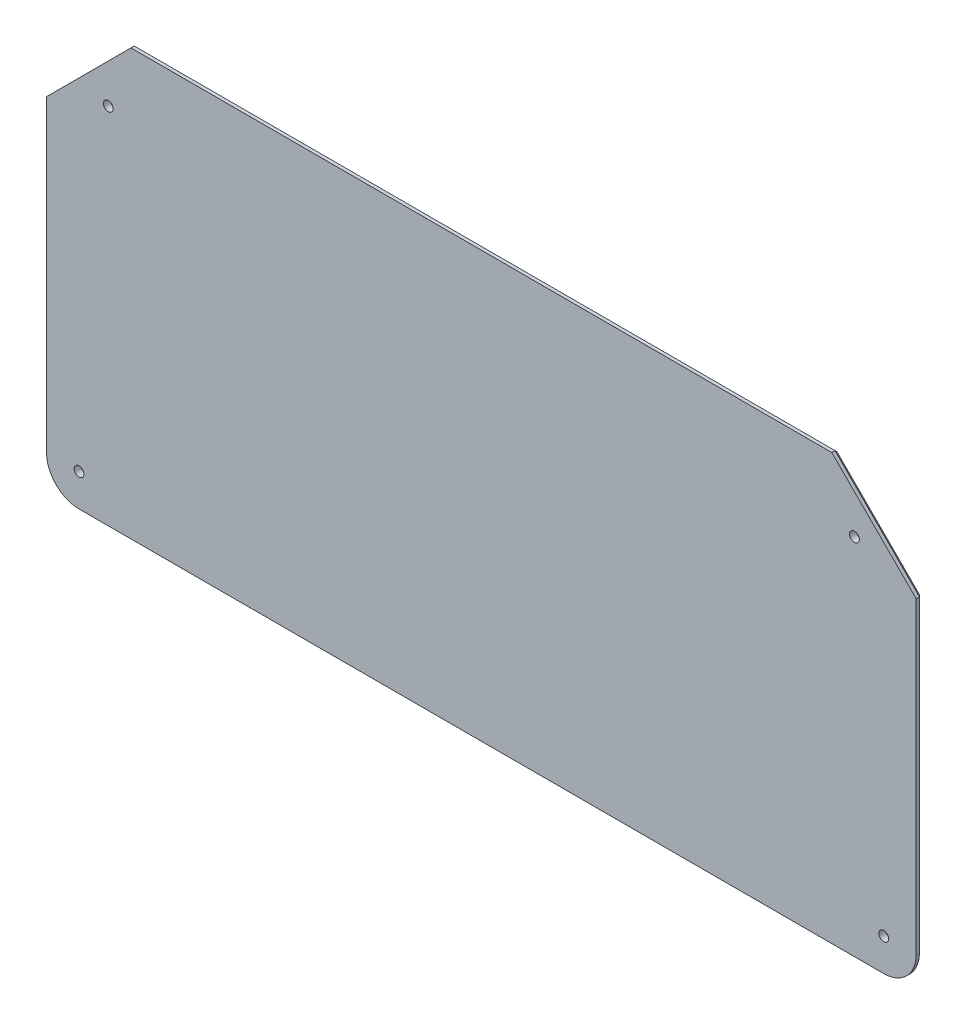
ISO-10303-21;
HEADER;
FILE_DESCRIPTION(('STEP AP214'),'2;1');
FILE_NAME('part.step','',(''),(''),'','','');
FILE_SCHEMA(('AUTOMOTIVE_DESIGN { 1 0 10303 214 1 1 1 1 }'));
ENDSEC;
DATA;
#1=APPLICATION_CONTEXT('core data for automotive mechanical design processes');
#2=APPLICATION_PROTOCOL_DEFINITION('international standard','automotive_design',2000,#1);
#3=PRODUCT_CONTEXT('',#1,'mechanical');
#4=PRODUCT('Part','Part','',(#3));
#5=PRODUCT_RELATED_PRODUCT_CATEGORY('part','',(#4));
#6=PRODUCT_DEFINITION_FORMATION('','',#4);
#7=PRODUCT_DEFINITION_CONTEXT('part definition',#1,'design');
#8=PRODUCT_DEFINITION('design','',#6,#7);
#9=PRODUCT_DEFINITION_SHAPE('','',#8);
#10=(LENGTH_UNIT() NAMED_UNIT(*) SI_UNIT(.MILLI.,.METRE.));
#11=(NAMED_UNIT(*) PLANE_ANGLE_UNIT() SI_UNIT($,.RADIAN.));
#12=(NAMED_UNIT(*) SI_UNIT($,.STERADIAN.) SOLID_ANGLE_UNIT());
#13=UNCERTAINTY_MEASURE_WITH_UNIT(LENGTH_MEASURE(1.E-05),#10,'distance_accuracy_value','');
#14=(GEOMETRIC_REPRESENTATION_CONTEXT(3) GLOBAL_UNCERTAINTY_ASSIGNED_CONTEXT((#13)) GLOBAL_UNIT_ASSIGNED_CONTEXT((#10,
#11,#12)) REPRESENTATION_CONTEXT('',''));
#15=CARTESIAN_POINT('',(0.,0.,0.));
#16=DIRECTION('',(0.,0.,1.));
#17=DIRECTION('',(1.,0.,0.));
#18=AXIS2_PLACEMENT_3D('',#15,#16,#17);
#19=CARTESIAN_POINT('',(192.203790483886,192.203790483885,-2.));
#20=DIRECTION('',(-0.707106781186548,-0.707106781186547,0.));
#21=DIRECTION('',(0.707106781186547,-0.707106781186548,0.));
#22=AXIS2_PLACEMENT_3D('',#19,#20,#21);
#23=PLANE('',#22);
#24=DIRECTION('',(0.,0.,1.));
#25=VECTOR('',#24,1.);
#26=CARTESIAN_POINT('',(274.168886442069,110.238694525702,-2.));
#27=LINE('',#26,#25);
#28=CARTESIAN_POINT('',(274.168886442069,110.238694525702,-1.));
#29=VERTEX_POINT('',#28);
#30=CARTESIAN_POINT('',(274.168886442069,110.238694525702,0.));
#31=VERTEX_POINT('',#30);
#32=EDGE_CURVE('E185',#29,#31,#27,.T.);
#33=ORIENTED_EDGE('',*,*,#32,.F.);
#34=DIRECTION('',(-0.707106781186547,0.707106781186548,0.));
#35=VECTOR('',#34,1.);
#36=CARTESIAN_POINT('',(192.203790483886,192.203790483885,-1.));
#37=LINE('',#36,#35);
#38=CARTESIAN_POINT('',(248.168886442069,136.238694525702,-0.999999999999999));
#39=VERTEX_POINT('',#38);
#40=EDGE_CURVE('E54',#29,#39,#37,.T.);
#41=ORIENTED_EDGE('',*,*,#40,.T.);
#42=DIRECTION('',(0.,0.,1.));
#43=VECTOR('',#42,1.);
#44=CARTESIAN_POINT('',(248.168886442069,136.238694525702,-2.));
#45=LINE('',#44,#43);
#46=CARTESIAN_POINT('',(248.168886442069,136.238694525702,0.));
#47=VERTEX_POINT('',#46);
#48=EDGE_CURVE('E133',#39,#47,#45,.T.);
#49=ORIENTED_EDGE('',*,*,#48,.T.);
#50=DIRECTION('',(0.707106781186547,-0.707106781186548,0.));
#51=VECTOR('',#50,1.);
#52=CARTESIAN_POINT('',(192.203790483886,192.203790483885,0.));
#53=LINE('',#52,#51);
#54=EDGE_CURVE('E136',#47,#31,#53,.T.);
#55=ORIENTED_EDGE('',*,*,#54,.T.);
#56=EDGE_LOOP('',(#33,#41,#49,#55));
#57=FACE_BOUND('',#56,.T.);
#58=ADVANCED_FACE('F43',(#57),#23,.F.);
#59=CARTESIAN_POINT('',(274.168886442069,0.,-2.));
#60=DIRECTION('',(-1.,0.,0.));
#61=DIRECTION('',(0.,0.,1.));
#62=AXIS2_PLACEMENT_3D('',#59,#60,#61);
#63=PLANE('',#62);
#64=DIRECTION('',(0.,0.,1.));
#65=VECTOR('',#64,1.);
#66=CARTESIAN_POINT('',(274.168886442069,15.286374555593,-2.));
#67=LINE('',#66,#65);
#68=CARTESIAN_POINT('',(274.168886442069,15.286374555593,-0.999999999999999));
#69=VERTEX_POINT('',#68);
#70=CARTESIAN_POINT('',(274.168886442069,15.286374555593,0.));
#71=VERTEX_POINT('',#70);
#72=EDGE_CURVE('E189',#69,#71,#67,.T.);
#73=ORIENTED_EDGE('',*,*,#72,.F.);
#74=DIRECTION('',(0.,1.,0.));
#75=VECTOR('',#74,1.);
#76=CARTESIAN_POINT('',(274.168886442069,0.,-0.999999999999999));
#77=LINE('',#76,#75);
#78=EDGE_CURVE('E69',#69,#29,#77,.T.);
#79=ORIENTED_EDGE('',*,*,#78,.T.);
#80=ORIENTED_EDGE('',*,*,#32,.T.);
#81=DIRECTION('',(0.,-1.,0.));
#82=VECTOR('',#81,1.);
#83=CARTESIAN_POINT('',(274.168886442069,0.,0.));
#84=LINE('',#83,#82);
#85=EDGE_CURVE('E141',#31,#71,#84,.T.);
#86=ORIENTED_EDGE('',*,*,#85,.T.);
#87=EDGE_LOOP('',(#73,#79,#80,#86));
#88=FACE_BOUND('',#87,.T.);
#89=ADVANCED_FACE('F331',(#88),#63,.F.);
#90=CARTESIAN_POINT('',(264.168886442069,15.2863745555929,-2.));
#91=DIRECTION('',(0.,0.,1.));
#92=DIRECTION('',(1.,0.,0.));
#93=AXIS2_PLACEMENT_3D('',#90,#91,#92);
#94=CYLINDRICAL_SURFACE('',#93,10.);
#95=DIRECTION('',(0.,0.,1.));
#96=VECTOR('',#95,1.);
#97=CARTESIAN_POINT('',(264.168886442069,5.28637455559292,-2.));
#98=LINE('',#97,#96);
#99=CARTESIAN_POINT('',(264.168886442069,5.28637455559292,-0.999999999999999));
#100=VERTEX_POINT('',#99);
#101=CARTESIAN_POINT('',(264.168886442069,5.28637455559292,0.));
#102=VERTEX_POINT('',#101);
#103=EDGE_CURVE('E192',#100,#102,#98,.T.);
#104=ORIENTED_EDGE('',*,*,#103,.F.);
#105=CARTESIAN_POINT('',(264.168886442069,15.2863745555929,-0.999999999999999));
#106=DIRECTION('',(0.,0.,1.));
#107=DIRECTION('',(1.,0.,0.));
#108=AXIS2_PLACEMENT_3D('',#105,#106,#107);
#109=CIRCLE('',#108,10.);
#110=EDGE_CURVE('E240',#100,#69,#109,.T.);
#111=ORIENTED_EDGE('',*,*,#110,.T.);
#112=ORIENTED_EDGE('',*,*,#72,.T.);
#113=CARTESIAN_POINT('',(264.168886442069,15.2863745555929,0.));
#114=DIRECTION('',(0.,0.,1.));
#115=DIRECTION('',(1.,0.,0.));
#116=AXIS2_PLACEMENT_3D('',#113,#114,#115);
#117=CIRCLE('',#116,10.);
#118=EDGE_CURVE('E180',#102,#71,#117,.T.);
#119=ORIENTED_EDGE('',*,*,#118,.F.);
#120=EDGE_LOOP('',(#104,#111,#112,#119));
#121=FACE_BOUND('',#120,.T.);
#122=ADVANCED_FACE('F336',(#121),#94,.T.);
#123=CARTESIAN_POINT('',(0.,5.28637455559292,-2.));
#124=DIRECTION('',(0.,-1.,0.));
#125=DIRECTION('',(0.,0.,-1.));
#126=AXIS2_PLACEMENT_3D('',#123,#124,#125);
#127=PLANE('',#126);
#128=DIRECTION('',(0.,0.,1.));
#129=VECTOR('',#128,1.);
#130=CARTESIAN_POINT('',(16.4118644100123,5.28637455559292,-2.));
#131=LINE('',#130,#129);
#132=CARTESIAN_POINT('',(16.4118644100123,5.28637455559292,-0.999999999999999));
#133=VERTEX_POINT('',#132);
#134=CARTESIAN_POINT('',(16.4118644100123,5.28637455559292,0.));
#135=VERTEX_POINT('',#134);
#136=EDGE_CURVE('E195',#133,#135,#131,.T.);
#137=ORIENTED_EDGE('',*,*,#136,.F.);
#138=DIRECTION('',(1.,0.,0.));
#139=VECTOR('',#138,1.);
#140=CARTESIAN_POINT('',(264.168886442069,5.28637455559292,-0.999999999999999));
#141=LINE('',#140,#139);
#142=EDGE_CURVE('E237',#133,#100,#141,.T.);
#143=ORIENTED_EDGE('',*,*,#142,.T.);
#144=ORIENTED_EDGE('',*,*,#103,.T.);
#145=DIRECTION('',(1.,0.,0.));
#146=VECTOR('',#145,1.);
#147=CARTESIAN_POINT('',(0.,5.28637455559292,0.));
#148=LINE('',#147,#146);
#149=EDGE_CURVE('E176',#135,#102,#148,.T.);
#150=ORIENTED_EDGE('',*,*,#149,.F.);
#151=EDGE_LOOP('',(#137,#143,#144,#150));
#152=FACE_BOUND('',#151,.T.);
#153=ADVANCED_FACE('F421',(#152),#127,.T.);
#154=CARTESIAN_POINT('',(16.4118644100122,15.2863745555929,-2.));
#155=DIRECTION('',(0.,0.,1.));
#156=DIRECTION('',(1.,0.,0.));
#157=AXIS2_PLACEMENT_3D('',#154,#155,#156);
#158=CYLINDRICAL_SURFACE('',#157,10.);
#159=DIRECTION('',(0.,0.,1.));
#160=VECTOR('',#159,1.);
#161=CARTESIAN_POINT('',(6.41186441001222,15.286374555593,-2.));
#162=LINE('',#161,#160);
#163=CARTESIAN_POINT('',(6.41186441001222,15.286374555593,-0.999999999999999));
#164=VERTEX_POINT('',#163);
#165=CARTESIAN_POINT('',(6.41186441001222,15.286374555593,0.));
#166=VERTEX_POINT('',#165);
#167=EDGE_CURVE('E198',#164,#166,#162,.T.);
#168=ORIENTED_EDGE('',*,*,#167,.F.);
#169=CARTESIAN_POINT('',(16.4118644100122,15.2863745555929,-0.999999999999999));
#170=DIRECTION('',(0.,0.,1.));
#171=DIRECTION('',(1.,0.,0.));
#172=AXIS2_PLACEMENT_3D('',#169,#170,#171);
#173=CIRCLE('',#172,10.);
#174=EDGE_CURVE('E234',#164,#133,#173,.T.);
#175=ORIENTED_EDGE('',*,*,#174,.T.);
#176=ORIENTED_EDGE('',*,*,#136,.T.);
#177=CARTESIAN_POINT('',(16.4118644100122,15.2863745555929,0.));
#178=DIRECTION('',(0.,0.,1.));
#179=DIRECTION('',(1.,0.,0.));
#180=AXIS2_PLACEMENT_3D('',#177,#178,#179);
#181=CIRCLE('',#180,10.);
#182=EDGE_CURVE('E172',#166,#135,#181,.T.);
#183=ORIENTED_EDGE('',*,*,#182,.F.);
#184=EDGE_LOOP('',(#168,#175,#176,#183));
#185=FACE_BOUND('',#184,.T.);
#186=ADVANCED_FACE('F416',(#185),#158,.T.);
#187=CARTESIAN_POINT('',(6.41186441001222,0.,-2.));
#188=DIRECTION('',(-1.,0.,0.));
#189=DIRECTION('',(0.,-1.,0.));
#190=AXIS2_PLACEMENT_3D('',#187,#188,#189);
#191=PLANE('',#190);
#192=DIRECTION('',(0.,0.,1.));
#193=VECTOR('',#192,1.);
#194=CARTESIAN_POINT('',(6.4118644100122,110.238694525702,-2.));
#195=LINE('',#194,#193);
#196=CARTESIAN_POINT('',(6.4118644100122,110.238694525702,-0.999999999999999));
#197=VERTEX_POINT('',#196);
#198=CARTESIAN_POINT('',(6.4118644100122,110.238694525702,0.));
#199=VERTEX_POINT('',#198);
#200=EDGE_CURVE('E201',#197,#199,#195,.T.);
#201=ORIENTED_EDGE('',*,*,#200,.F.);
#202=DIRECTION('',(0.,-1.,0.));
#203=VECTOR('',#202,1.);
#204=CARTESIAN_POINT('',(6.41186441001222,15.286374555593,-0.999999999999999));
#205=LINE('',#204,#203);
#206=EDGE_CURVE('E188',#197,#164,#205,.T.);
#207=ORIENTED_EDGE('',*,*,#206,.T.);
#208=ORIENTED_EDGE('',*,*,#167,.T.);
#209=DIRECTION('',(0.,-1.,0.));
#210=VECTOR('',#209,1.);
#211=CARTESIAN_POINT('',(6.41186441001222,0.,0.));
#212=LINE('',#211,#210);
#213=EDGE_CURVE('E168',#199,#166,#212,.T.);
#214=ORIENTED_EDGE('',*,*,#213,.F.);
#215=EDGE_LOOP('',(#201,#207,#208,#214));
#216=FACE_BOUND('',#215,.T.);
#217=ADVANCED_FACE('F410',(#216),#191,.T.);
#218=CARTESIAN_POINT('',(-51.9134150578452,51.9134150578457,-2.));
#219=DIRECTION('',(0.707106781186544,-0.707106781186551,0.));
#220=DIRECTION('',(0.707106781186551,0.707106781186544,0.));
#221=AXIS2_PLACEMENT_3D('',#218,#219,#220);
#222=PLANE('',#221);
#223=DIRECTION('',(0.,0.,1.));
#224=VECTOR('',#223,1.);
#225=CARTESIAN_POINT('',(32.4118644100122,136.238694525702,-2.));
#226=LINE('',#225,#224);
#227=CARTESIAN_POINT('',(32.4118644100122,136.238694525702,-0.999999999999999));
#228=VERTEX_POINT('',#227);
#229=CARTESIAN_POINT('',(32.4118644100122,136.238694525702,0.));
#230=VERTEX_POINT('',#229);
#231=EDGE_CURVE('E140',#228,#230,#226,.T.);
#232=ORIENTED_EDGE('',*,*,#231,.F.);
#233=DIRECTION('',(-0.707106781186551,-0.707106781186544,0.));
#234=VECTOR('',#233,1.);
#235=CARTESIAN_POINT('',(-51.9134150578452,51.9134150578457,-0.999999999999997));
#236=LINE('',#235,#234);
#237=EDGE_CURVE('E243',#228,#197,#236,.T.);
#238=ORIENTED_EDGE('',*,*,#237,.T.);
#239=ORIENTED_EDGE('',*,*,#200,.T.);
#240=DIRECTION('',(0.707106781186551,0.707106781186544,0.));
#241=VECTOR('',#240,1.);
#242=CARTESIAN_POINT('',(-51.9134150578452,51.9134150578457,0.));
#243=LINE('',#242,#241);
#244=EDGE_CURVE('E151',#199,#230,#243,.T.);
#245=ORIENTED_EDGE('',*,*,#244,.T.);
#246=EDGE_LOOP('',(#232,#238,#239,#245));
#247=FACE_BOUND('',#246,.T.);
#248=ADVANCED_FACE('F406',(#247),#222,.F.);
#249=CARTESIAN_POINT('',(0.,136.238694525702,-2.));
#250=DIRECTION('',(0.,-1.,0.));
#251=DIRECTION('',(0.,0.,-1.));
#252=AXIS2_PLACEMENT_3D('',#249,#250,#251);
#253=PLANE('',#252);
#254=ORIENTED_EDGE('',*,*,#48,.F.);
#255=DIRECTION('',(-1.,0.,0.));
#256=VECTOR('',#255,1.);
#257=CARTESIAN_POINT('',(0.,136.238694525702,-0.999999999999999));
#258=LINE('',#257,#256);
#259=EDGE_CURVE('E11',#39,#228,#258,.T.);
#260=ORIENTED_EDGE('',*,*,#259,.T.);
#261=ORIENTED_EDGE('',*,*,#231,.T.);
#262=DIRECTION('',(1.,0.,0.));
#263=VECTOR('',#262,1.);
#264=CARTESIAN_POINT('',(0.,136.238694525702,0.));
#265=LINE('',#264,#263);
#266=EDGE_CURVE('E144',#230,#47,#265,.T.);
#267=ORIENTED_EDGE('',*,*,#266,.T.);
#268=EDGE_LOOP('',(#254,#260,#261,#267));
#269=FACE_BOUND('',#268,.T.);
#270=ADVANCED_FACE('F145',(#269),#253,.F.);
#271=CARTESIAN_POINT('',(0.,0.,-2.));
#272=DIRECTION('',(0.,0.,1.));
#273=DIRECTION('',(1.,0.,0.));
#274=AXIS2_PLACEMENT_3D('',#271,#272,#273);
#275=PLANE('',#274);
#276=CARTESIAN_POINT('',(16.4118644100122,15.2863745555929,-2.));
#277=DIRECTION('',(0.,0.,1.));
#278=DIRECTION('',(1.,0.,0.));
#279=AXIS2_PLACEMENT_3D('',#276,#277,#278);
#280=CIRCLE('',#279,9.);
#281=CARTESIAN_POINT('',(16.4118644100123,6.28637455559292,-2.));
#282=VERTEX_POINT('',#281);
#283=CARTESIAN_POINT('',(7.41186441001222,15.286374555593,-2.));
#284=VERTEX_POINT('',#283);
#285=EDGE_CURVE('E227',#282,#284,#280,.F.);
#286=ORIENTED_EDGE('',*,*,#285,.T.);
#287=DIRECTION('',(0.,1.,0.));
#288=VECTOR('',#287,1.);
#289=CARTESIAN_POINT('',(7.4118644100122,110.238694525702,-2.));
#290=LINE('',#289,#288);
#291=CARTESIAN_POINT('',(7.4118644100122,109.824480963329,-2.));
#292=VERTEX_POINT('',#291);
#293=EDGE_CURVE('E230',#284,#292,#290,.T.);
#294=ORIENTED_EDGE('',*,*,#293,.T.);
#295=DIRECTION('',(0.707106781186551,0.707106781186544,0.));
#296=VECTOR('',#295,1.);
#297=CARTESIAN_POINT('',(-51.2063082766586,51.2063082766592,-2.));
#298=LINE('',#297,#296);
#299=CARTESIAN_POINT('',(32.8260779723853,135.238694525702,-2.));
#300=VERTEX_POINT('',#299);
#301=EDGE_CURVE('E218',#292,#300,#298,.T.);
#302=ORIENTED_EDGE('',*,*,#301,.T.);
#303=DIRECTION('',(1.,0.,0.));
#304=VECTOR('',#303,1.);
#305=CARTESIAN_POINT('',(0.,135.238694525702,-2.));
#306=LINE('',#305,#304);
#307=CARTESIAN_POINT('',(247.754672879696,135.238694525702,-2.));
#308=VERTEX_POINT('',#307);
#309=EDGE_CURVE('E209',#300,#308,#306,.T.);
#310=ORIENTED_EDGE('',*,*,#309,.T.);
#311=DIRECTION('',(0.707106781186547,-0.707106781186548,0.));
#312=VECTOR('',#311,1.);
#313=CARTESIAN_POINT('',(191.496683702699,191.496683702699,-2.));
#314=LINE('',#313,#312);
#315=CARTESIAN_POINT('',(273.168886442069,109.824480963329,-2.));
#316=VERTEX_POINT('',#315);
#317=EDGE_CURVE('E212',#308,#316,#314,.T.);
#318=ORIENTED_EDGE('',*,*,#317,.T.);
#319=DIRECTION('',(0.,-1.,0.));
#320=VECTOR('',#319,1.);
#321=CARTESIAN_POINT('',(273.168886442069,0.,-2.));
#322=LINE('',#321,#320);
#323=CARTESIAN_POINT('',(273.168886442069,15.286374555593,-2.));
#324=VERTEX_POINT('',#323);
#325=EDGE_CURVE('E215',#316,#324,#322,.T.);
#326=ORIENTED_EDGE('',*,*,#325,.T.);
#327=CARTESIAN_POINT('',(264.168886442069,15.2863745555929,-2.));
#328=DIRECTION('',(0.,0.,1.));
#329=DIRECTION('',(1.,0.,0.));
#330=AXIS2_PLACEMENT_3D('',#327,#328,#329);
#331=CIRCLE('',#330,9.00000000000001);
#332=CARTESIAN_POINT('',(264.168886442069,6.28637455559291,-2.));
#333=VERTEX_POINT('',#332);
#334=EDGE_CURVE('E221',#324,#333,#331,.F.);
#335=ORIENTED_EDGE('',*,*,#334,.T.);
#336=DIRECTION('',(-1.,0.,0.));
#337=VECTOR('',#336,1.);
#338=CARTESIAN_POINT('',(16.4118644100123,6.28637455559292,-2.));
#339=LINE('',#338,#337);
#340=EDGE_CURVE('E224',#333,#282,#339,.T.);
#341=ORIENTED_EDGE('',*,*,#340,.T.);
#342=EDGE_LOOP('',(#286,#294,#302,#310,#318,#326,#335,#341));
#343=FACE_BOUND('',#342,.T.);
#344=CARTESIAN_POINT('',(16.4118644100122,15.2863745555929,-2.));
#345=DIRECTION('',(0.,0.,1.));
#346=DIRECTION('',(1.,0.,0.));
#347=AXIS2_PLACEMENT_3D('',#344,#345,#346);
#348=CIRCLE('',#347,1.5);
#349=CARTESIAN_POINT('',(17.9118644100122,15.2863745555929,-2.));
#350=VERTEX_POINT('',#349);
#351=EDGE_CURVE('E286',#350,#350,#348,.T.);
#352=ORIENTED_EDGE('',*,*,#351,.T.);
#353=EDGE_LOOP('',(#352));
#354=FACE_BOUND('',#353,.T.);
#355=CARTESIAN_POINT('',(25.4222720500978,117.228286885617,-2.));
#356=DIRECTION('',(0.,0.,1.));
#357=DIRECTION('',(1.,0.,0.));
#358=AXIS2_PLACEMENT_3D('',#355,#356,#357);
#359=CIRCLE('',#358,1.5);
#360=CARTESIAN_POINT('',(26.9222720500978,117.228286885617,-2.));
#361=VERTEX_POINT('',#360);
#362=EDGE_CURVE('E298',#361,#361,#359,.T.);
#363=ORIENTED_EDGE('',*,*,#362,.T.);
#364=EDGE_LOOP('',(#363));
#365=FACE_BOUND('',#364,.T.);
#366=CARTESIAN_POINT('',(255.158478801983,117.228286885617,-2.));
#367=DIRECTION('',(0.,0.,1.));
#368=DIRECTION('',(1.,0.,0.));
#369=AXIS2_PLACEMENT_3D('',#366,#367,#368);
#370=CIRCLE('',#369,1.5);
#371=CARTESIAN_POINT('',(256.658478801983,117.228286885617,-2.));
#372=VERTEX_POINT('',#371);
#373=EDGE_CURVE('E306',#372,#372,#370,.T.);
#374=ORIENTED_EDGE('',*,*,#373,.T.);
#375=EDGE_LOOP('',(#374));
#376=FACE_BOUND('',#375,.T.);
#377=CARTESIAN_POINT('',(264.168886442069,15.2863745555929,-2.));
#378=DIRECTION('',(0.,0.,1.));
#379=DIRECTION('',(1.,0.,0.));
#380=AXIS2_PLACEMENT_3D('',#377,#378,#379);
#381=CIRCLE('',#380,1.5);
#382=CARTESIAN_POINT('',(265.668886442069,15.2863745555929,-2.));
#383=VERTEX_POINT('',#382);
#384=EDGE_CURVE('E158',#383,#383,#381,.T.);
#385=ORIENTED_EDGE('',*,*,#384,.T.);
#386=EDGE_LOOP('',(#385));
#387=FACE_BOUND('',#386,.T.);
#388=ADVANCED_FACE('F316',(#343,#354,#365,#376,#387),#275,.F.);
#389=CARTESIAN_POINT('',(0.,0.,0.));
#390=DIRECTION('',(0.,0.,1.));
#391=DIRECTION('',(1.,0.,0.));
#392=AXIS2_PLACEMENT_3D('',#389,#390,#391);
#393=PLANE('',#392);
#394=CARTESIAN_POINT('',(16.4118644100122,15.2863745555929,0.));
#395=DIRECTION('',(0.,0.,1.));
#396=DIRECTION('',(1.,0.,0.));
#397=AXIS2_PLACEMENT_3D('',#394,#395,#396);
#398=CIRCLE('',#397,1.49999999999999);
#399=CARTESIAN_POINT('',(17.9118644100122,15.2863745555929,0.));
#400=VERTEX_POINT('',#399);
#401=EDGE_CURVE('E280',#400,#400,#398,.T.);
#402=ORIENTED_EDGE('',*,*,#401,.F.);
#403=EDGE_LOOP('',(#402));
#404=FACE_BOUND('',#403,.T.);
#405=CARTESIAN_POINT('',(25.4222720500978,117.228286885617,0.));
#406=DIRECTION('',(0.,0.,1.));
#407=DIRECTION('',(1.,0.,0.));
#408=AXIS2_PLACEMENT_3D('',#405,#406,#407);
#409=CIRCLE('',#408,1.49999999999999);
#410=CARTESIAN_POINT('',(26.9222720500978,117.228286885617,0.));
#411=VERTEX_POINT('',#410);
#412=EDGE_CURVE('E292',#411,#411,#409,.T.);
#413=ORIENTED_EDGE('',*,*,#412,.F.);
#414=EDGE_LOOP('',(#413));
#415=FACE_BOUND('',#414,.T.);
#416=CARTESIAN_POINT('',(255.158478801983,117.228286885617,0.));
#417=DIRECTION('',(0.,0.,1.));
#418=DIRECTION('',(1.,0.,0.));
#419=AXIS2_PLACEMENT_3D('',#416,#417,#418);
#420=CIRCLE('',#419,1.5);
#421=CARTESIAN_POINT('',(256.658478801983,117.228286885617,0.));
#422=VERTEX_POINT('',#421);
#423=EDGE_CURVE('E302',#422,#422,#420,.T.);
#424=ORIENTED_EDGE('',*,*,#423,.F.);
#425=EDGE_LOOP('',(#424));
#426=FACE_BOUND('',#425,.T.);
#427=CARTESIAN_POINT('',(264.168886442069,15.2863745555929,0.));
#428=DIRECTION('',(0.,0.,1.));
#429=DIRECTION('',(1.,0.,0.));
#430=AXIS2_PLACEMENT_3D('',#427,#428,#429);
#431=CIRCLE('',#430,1.5);
#432=CARTESIAN_POINT('',(265.668886442069,15.2863745555929,0.));
#433=VERTEX_POINT('',#432);
#434=EDGE_CURVE('E162',#433,#433,#431,.T.);
#435=ORIENTED_EDGE('',*,*,#434,.F.);
#436=EDGE_LOOP('',(#435));
#437=FACE_BOUND('',#436,.T.);
#438=ORIENTED_EDGE('',*,*,#54,.F.);
#439=ORIENTED_EDGE('',*,*,#266,.F.);
#440=ORIENTED_EDGE('',*,*,#244,.F.);
#441=ORIENTED_EDGE('',*,*,#213,.T.);
#442=ORIENTED_EDGE('',*,*,#182,.T.);
#443=ORIENTED_EDGE('',*,*,#149,.T.);
#444=ORIENTED_EDGE('',*,*,#118,.T.);
#445=ORIENTED_EDGE('',*,*,#85,.F.);
#446=EDGE_LOOP('',(#438,#439,#440,#441,#442,#443,#444,#445));
#447=FACE_BOUND('',#446,.T.);
#448=ADVANCED_FACE('F154',(#404,#415,#426,#437,#447),#393,.T.);
#449=CARTESIAN_POINT('',(264.168886442069,15.2863745555929,0.));
#450=DIRECTION('',(0.,0.,1.));
#451=DIRECTION('',(1.,0.,0.));
#452=AXIS2_PLACEMENT_3D('',#449,#450,#451);
#453=CYLINDRICAL_SURFACE('',#452,1.5);
#454=ORIENTED_EDGE('',*,*,#384,.F.);
#455=EDGE_LOOP('',(#454));
#456=FACE_BOUND('',#455,.T.);
#457=ORIENTED_EDGE('',*,*,#434,.T.);
#458=EDGE_LOOP('',(#457));
#459=FACE_BOUND('',#458,.T.);
#460=ADVANCED_FACE('F313',(#456,#459),#453,.F.);
#461=CARTESIAN_POINT('',(255.158478801983,117.228286885617,0.));
#462=DIRECTION('',(0.,0.,1.));
#463=DIRECTION('',(1.,0.,0.));
#464=AXIS2_PLACEMENT_3D('',#461,#462,#463);
#465=CYLINDRICAL_SURFACE('',#464,1.5);
#466=ORIENTED_EDGE('',*,*,#373,.F.);
#467=EDGE_LOOP('',(#466));
#468=FACE_BOUND('',#467,.T.);
#469=ORIENTED_EDGE('',*,*,#423,.T.);
#470=EDGE_LOOP('',(#469));
#471=FACE_BOUND('',#470,.T.);
#472=ADVANCED_FACE('F323',(#468,#471),#465,.F.);
#473=CARTESIAN_POINT('',(25.4222720500978,117.228286885617,0.));
#474=DIRECTION('',(0.,0.,1.));
#475=DIRECTION('',(1.,0.,0.));
#476=AXIS2_PLACEMENT_3D('',#473,#474,#475);
#477=CYLINDRICAL_SURFACE('',#476,1.49999999999999);
#478=ORIENTED_EDGE('',*,*,#362,.F.);
#479=EDGE_LOOP('',(#478));
#480=FACE_BOUND('',#479,.T.);
#481=ORIENTED_EDGE('',*,*,#412,.T.);
#482=EDGE_LOOP('',(#481));
#483=FACE_BOUND('',#482,.T.);
#484=ADVANCED_FACE('F393',(#480,#483),#477,.F.);
#485=CARTESIAN_POINT('',(16.4118644100122,15.2863745555929,0.));
#486=DIRECTION('',(0.,0.,1.));
#487=DIRECTION('',(1.,0.,0.));
#488=AXIS2_PLACEMENT_3D('',#485,#486,#487);
#489=CYLINDRICAL_SURFACE('',#488,1.49999999999999);
#490=ORIENTED_EDGE('',*,*,#351,.F.);
#491=EDGE_LOOP('',(#490));
#492=FACE_BOUND('',#491,.T.);
#493=ORIENTED_EDGE('',*,*,#401,.T.);
#494=EDGE_LOOP('',(#493));
#495=FACE_BOUND('',#494,.T.);
#496=ADVANCED_FACE('F388',(#492,#495),#489,.F.);
#497=CARTESIAN_POINT('',(273.168886442069,0.,-2.));
#498=DIRECTION('',(-0.707106781186547,0.,0.707106781186547));
#499=DIRECTION('',(0.,-1.,0.));
#500=AXIS2_PLACEMENT_3D('',#497,#498,#499);
#501=PLANE('',#500);
#502=DIRECTION('',(0.707106781186547,0.,0.707106781186547));
#503=VECTOR('',#502,1.);
#504=CARTESIAN_POINT('',(273.168886442069,15.286374555593,-2.));
#505=LINE('',#504,#503);
#506=EDGE_CURVE('E271',#324,#69,#505,.T.);
#507=ORIENTED_EDGE('',*,*,#506,.F.);
#508=ORIENTED_EDGE('',*,*,#325,.F.);
#509=DIRECTION('',(-0.678598344545844,-0.281084637714833,-0.678598344545844));
#510=VECTOR('',#509,1.);
#511=CARTESIAN_POINT('',(251.137634697757,100.698837694779,-24.0312517443118));
#512=LINE('',#511,#510);
#513=EDGE_CURVE('E48',#29,#316,#512,.T.);
#514=ORIENTED_EDGE('',*,*,#513,.F.);
#515=ORIENTED_EDGE('',*,*,#78,.F.);
#516=EDGE_LOOP('',(#507,#508,#514,#515));
#517=FACE_BOUND('',#516,.T.);
#518=ADVANCED_FACE('F46',(#517),#501,.F.);
#519=CARTESIAN_POINT('',(191.496683702699,191.496683702699,-2.));
#520=DIRECTION('',(-0.499999999999996,-0.499999999999996,0.707106781186553));
#521=DIRECTION('',(0.707106781186547,-0.707106781186548,0.));
#522=AXIS2_PLACEMENT_3D('',#519,#520,#521);
#523=PLANE('',#522);
#524=ORIENTED_EDGE('',*,*,#513,.T.);
#525=ORIENTED_EDGE('',*,*,#317,.F.);
#526=DIRECTION('',(-0.281084637714834,-0.678598344545844,-0.678598344545844));
#527=VECTOR('',#526,1.);
#528=CARTESIAN_POINT('',(228.179929582825,87.9810837784278,-49.2576107472744));
#529=LINE('',#528,#527);
#530=EDGE_CURVE('E268',#39,#308,#529,.T.);
#531=ORIENTED_EDGE('',*,*,#530,.F.);
#532=ORIENTED_EDGE('',*,*,#40,.F.);
#533=EDGE_LOOP('',(#524,#525,#531,#532));
#534=FACE_BOUND('',#533,.T.);
#535=ADVANCED_FACE('F381',(#534),#523,.F.);
#536=CARTESIAN_POINT('',(264.168886442069,15.2863745555929,-0.999999999999999));
#537=DIRECTION('',(0.,0.,1.));
#538=DIRECTION('',(1.,0.,0.));
#539=AXIS2_PLACEMENT_3D('',#536,#537,#538);
#540=CONICAL_SURFACE('',#539,10.,0.785398163397446);
#541=ORIENTED_EDGE('',*,*,#506,.T.);
#542=ORIENTED_EDGE('',*,*,#110,.F.);
#543=DIRECTION('',(0.,-0.707106781186546,0.707106781186549));
#544=VECTOR('',#543,1.);
#545=CARTESIAN_POINT('',(264.168886442069,6.28637455559291,-2.));
#546=LINE('',#545,#544);
#547=EDGE_CURVE('E264',#333,#100,#546,.T.);
#548=ORIENTED_EDGE('',*,*,#547,.F.);
#549=ORIENTED_EDGE('',*,*,#334,.F.);
#550=EDGE_LOOP('',(#541,#542,#548,#549));
#551=FACE_BOUND('',#550,.T.);
#552=ADVANCED_FACE('F375',(#551),#540,.T.);
#553=CARTESIAN_POINT('',(0.,135.238694525702,-2.));
#554=DIRECTION('',(0.,-0.707106781186547,0.707106781186547));
#555=DIRECTION('',(1.,0.,0.));
#556=AXIS2_PLACEMENT_3D('',#553,#554,#555);
#557=PLANE('',#556);
#558=ORIENTED_EDGE('',*,*,#530,.T.);
#559=ORIENTED_EDGE('',*,*,#309,.F.);
#560=DIRECTION('',(-0.281084637714819,0.678598344545847,0.678598344545847));
#561=VECTOR('',#560,1.);
#562=CARTESIAN_POINT('',(30.2325363762417,141.500057821691,4.2613632959886));
#563=LINE('',#562,#561);
#564=EDGE_CURVE('E260',#228,#300,#563,.F.);
#565=ORIENTED_EDGE('',*,*,#564,.F.);
#566=ORIENTED_EDGE('',*,*,#259,.F.);
#567=EDGE_LOOP('',(#558,#559,#565,#566));
#568=FACE_BOUND('',#567,.T.);
#569=ADVANCED_FACE('F368',(#568),#557,.F.);
#570=CARTESIAN_POINT('',(0.,5.28637455559292,-0.999999999999999));
#571=DIRECTION('',(0.,-0.707106781186547,-0.707106781186547));
#572=DIRECTION('',(-1.,0.,0.));
#573=AXIS2_PLACEMENT_3D('',#570,#571,#572);
#574=PLANE('',#573);
#575=ORIENTED_EDGE('',*,*,#547,.T.);
#576=ORIENTED_EDGE('',*,*,#142,.F.);
#577=DIRECTION('',(0.,-0.707106781186547,0.707106781186547));
#578=VECTOR('',#577,1.);
#579=CARTESIAN_POINT('',(16.4118644100123,6.28637455559292,-2.));
#580=LINE('',#579,#578);
#581=EDGE_CURVE('E256',#282,#133,#580,.T.);
#582=ORIENTED_EDGE('',*,*,#581,.F.);
#583=ORIENTED_EDGE('',*,*,#340,.F.);
#584=EDGE_LOOP('',(#575,#576,#582,#583));
#585=FACE_BOUND('',#584,.T.);
#586=ADVANCED_FACE('F361',(#585),#574,.T.);
#587=CARTESIAN_POINT('',(-51.2063082766586,51.2063082766592,-2.));
#588=DIRECTION('',(0.499999999999997,-0.500000000000002,0.707106781186548));
#589=DIRECTION('',(0.707106781186551,0.707106781186544,0.));
#590=AXIS2_PLACEMENT_3D('',#587,#588,#589);
#591=PLANE('',#590);
#592=ORIENTED_EDGE('',*,*,#564,.T.);
#593=ORIENTED_EDGE('',*,*,#301,.F.);
#594=DIRECTION('',(0.678598344545846,-0.281084637714823,-0.678598344545847));
#595=VECTOR('',#594,1.);
#596=CARTESIAN_POINT('',(-8.40051331381173,116.374182269904,13.8123777238239));
#597=LINE('',#596,#595);
#598=EDGE_CURVE('E253',#197,#292,#597,.T.);
#599=ORIENTED_EDGE('',*,*,#598,.F.);
#600=ORIENTED_EDGE('',*,*,#237,.F.);
#601=EDGE_LOOP('',(#592,#593,#599,#600));
#602=FACE_BOUND('',#601,.T.);
#603=ADVANCED_FACE('F354',(#602),#591,.F.);
#604=CARTESIAN_POINT('',(16.4118644100122,15.2863745555929,-0.999999999999999));
#605=DIRECTION('',(0.,0.,1.));
#606=DIRECTION('',(1.,0.,0.));
#607=AXIS2_PLACEMENT_3D('',#604,#605,#606);
#608=CONICAL_SURFACE('',#607,10.,0.785398163397448);
#609=ORIENTED_EDGE('',*,*,#581,.T.);
#610=ORIENTED_EDGE('',*,*,#174,.F.);
#611=DIRECTION('',(-0.707106781186547,0.,0.707106781186547));
#612=VECTOR('',#611,1.);
#613=CARTESIAN_POINT('',(7.41186441001222,15.286374555593,-2.));
#614=LINE('',#613,#612);
#615=EDGE_CURVE('E250',#284,#164,#614,.T.);
#616=ORIENTED_EDGE('',*,*,#615,.F.);
#617=ORIENTED_EDGE('',*,*,#285,.F.);
#618=EDGE_LOOP('',(#609,#610,#616,#617));
#619=FACE_BOUND('',#618,.T.);
#620=ADVANCED_FACE('F347',(#619),#608,.T.);
#621=CARTESIAN_POINT('',(6.41186441001222,0.,-0.999999999999999));
#622=DIRECTION('',(-0.707106781186547,0.,-0.707106781186547));
#623=DIRECTION('',(0.,1.,0.));
#624=AXIS2_PLACEMENT_3D('',#621,#622,#623);
#625=PLANE('',#624);
#626=ORIENTED_EDGE('',*,*,#598,.T.);
#627=ORIENTED_EDGE('',*,*,#293,.F.);
#628=ORIENTED_EDGE('',*,*,#615,.T.);
#629=ORIENTED_EDGE('',*,*,#206,.F.);
#630=EDGE_LOOP('',(#626,#627,#628,#629));
#631=FACE_BOUND('',#630,.T.);
#632=ADVANCED_FACE('F341',(#631),#625,.T.);
#633=CLOSED_SHELL('',(#58,#89,#122,#153,#186,#217,#248,#270,#388,#448,#460,#472,#484,#496,#518,
#535,#552,#569,#586,#603,#620,#632));
#634=MANIFOLD_SOLID_BREP('B2',#633);
#635=ADVANCED_BREP_SHAPE_REPRESENTATION('',(#18,#634),#14);
#636=SHAPE_DEFINITION_REPRESENTATION(#9,#635);
ENDSEC;
END-ISO-10303-21;
